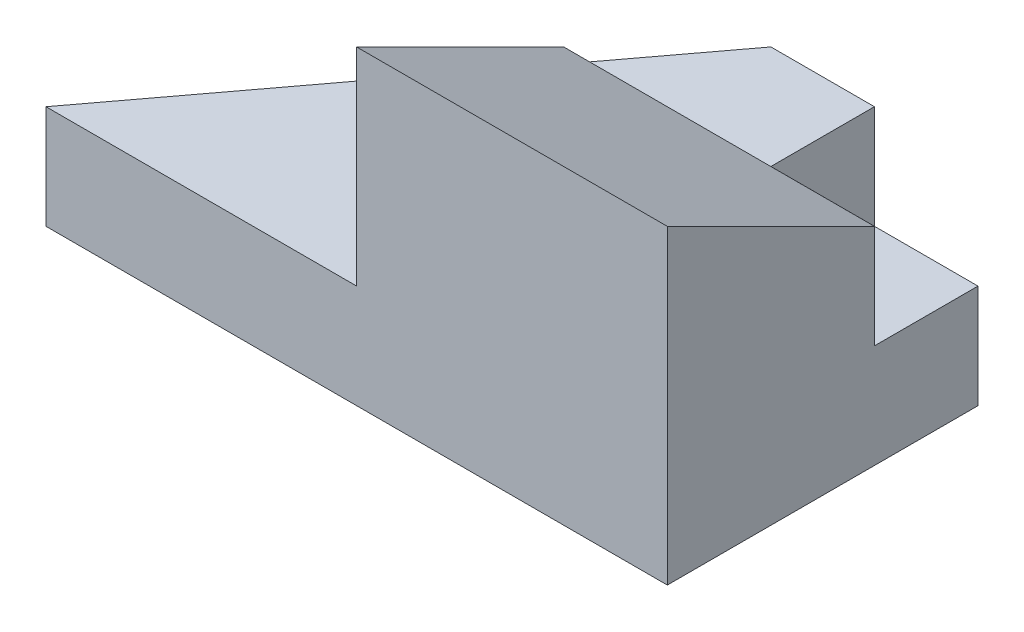
ISO-10303-21;
HEADER;
FILE_DESCRIPTION(('STEP AP214'),'2;1');
FILE_NAME('part.step','',(''),(''),'','','');
FILE_SCHEMA(('AUTOMOTIVE_DESIGN { 1 0 10303 214 1 1 1 1 }'));
ENDSEC;
DATA;
#1=APPLICATION_CONTEXT('core data for automotive mechanical design processes');
#2=APPLICATION_PROTOCOL_DEFINITION('international standard','automotive_design',2000,#1);
#3=PRODUCT_CONTEXT('',#1,'mechanical');
#4=PRODUCT('Part','Part','',(#3));
#5=PRODUCT_RELATED_PRODUCT_CATEGORY('part','',(#4));
#6=PRODUCT_DEFINITION_FORMATION('','',#4);
#7=PRODUCT_DEFINITION_CONTEXT('part definition',#1,'design');
#8=PRODUCT_DEFINITION('design','',#6,#7);
#9=PRODUCT_DEFINITION_SHAPE('','',#8);
#10=(LENGTH_UNIT() NAMED_UNIT(*) SI_UNIT(.MILLI.,.METRE.));
#11=(NAMED_UNIT(*) PLANE_ANGLE_UNIT() SI_UNIT($,.RADIAN.));
#12=(NAMED_UNIT(*) SI_UNIT($,.STERADIAN.) SOLID_ANGLE_UNIT());
#13=UNCERTAINTY_MEASURE_WITH_UNIT(LENGTH_MEASURE(1.E-05),#10,'distance_accuracy_value','');
#14=(GEOMETRIC_REPRESENTATION_CONTEXT(3) GLOBAL_UNCERTAINTY_ASSIGNED_CONTEXT((#13)) GLOBAL_UNIT_ASSIGNED_CONTEXT((#10,
#11,#12)) REPRESENTATION_CONTEXT('',''));
#15=CARTESIAN_POINT('',(0.,0.,0.));
#16=DIRECTION('',(0.,0.,1.));
#17=DIRECTION('',(1.,0.,0.));
#18=AXIS2_PLACEMENT_3D('',#15,#16,#17);
#19=CARTESIAN_POINT('',(0.,0.,1016.));
#20=DIRECTION('',(-1.,0.,0.));
#21=DIRECTION('',(0.,0.,1.));
#22=AXIS2_PLACEMENT_3D('',#19,#20,#21);
#23=PLANE('',#22);
#24=DIRECTION('',(0.,1.,0.));
#25=VECTOR('',#24,1.);
#26=CARTESIAN_POINT('',(0.,0.,508.));
#27=LINE('',#26,#25);
#28=CARTESIAN_POINT('',(0.,254.121643215491,508.));
#29=VERTEX_POINT('',#28);
#30=CARTESIAN_POINT('',(0.,508.060821607745,508.));
#31=VERTEX_POINT('',#30);
#32=EDGE_CURVE('E179',#29,#31,#27,.T.);
#33=ORIENTED_EDGE('',*,*,#32,.T.);
#34=DIRECTION('',(0.,0.447127919267341,0.894470023987198));
#35=VECTOR('',#34,1.);
#36=CARTESIAN_POINT('',(0.,609.658387344484,711.243799247628));
#37=LINE('',#36,#35);
#38=CARTESIAN_POINT('',(0.,762.,1016.));
#39=VERTEX_POINT('',#38);
#40=EDGE_CURVE('E54',#31,#39,#37,.T.);
#41=ORIENTED_EDGE('',*,*,#40,.T.);
#42=DIRECTION('',(0.,1.,0.));
#43=VECTOR('',#42,1.);
#44=CARTESIAN_POINT('',(0.,0.,1016.));
#45=LINE('',#44,#43);
#46=CARTESIAN_POINT('',(0.,0.,1016.));
#47=VERTEX_POINT('',#46);
#48=EDGE_CURVE('E134',#47,#39,#45,.T.);
#49=ORIENTED_EDGE('',*,*,#48,.F.);
#50=DIRECTION('',(0.,0.,-1.));
#51=VECTOR('',#50,1.);
#52=CARTESIAN_POINT('',(0.,0.,1016.));
#53=LINE('',#52,#51);
#54=CARTESIAN_POINT('',(0.,0.,254.));
#55=VERTEX_POINT('',#54);
#56=EDGE_CURVE('E47',#47,#55,#53,.T.);
#57=ORIENTED_EDGE('',*,*,#56,.T.);
#58=DIRECTION('',(0.,1.,0.));
#59=VECTOR('',#58,1.);
#60=CARTESIAN_POINT('',(0.,-827.156356784508,254.));
#61=LINE('',#60,#59);
#62=CARTESIAN_POINT('',(0.,254.121643215491,254.));
#63=VERTEX_POINT('',#62);
#64=EDGE_CURVE('E155',#55,#63,#61,.T.);
#65=ORIENTED_EDGE('',*,*,#64,.T.);
#66=DIRECTION('',(0.,0.,1.));
#67=VECTOR('',#66,1.);
#68=CARTESIAN_POINT('',(0.,254.121643215491,1016.));
#69=LINE('',#68,#67);
#70=EDGE_CURVE('E185',#63,#29,#69,.T.);
#71=ORIENTED_EDGE('',*,*,#70,.T.);
#72=EDGE_LOOP('',(#33,#41,#49,#57,#65,#71));
#73=FACE_BOUND('',#72,.T.);
#74=ADVANCED_FACE('F39',(#73),#23,.F.);
#75=CARTESIAN_POINT('',(0.,0.,1016.));
#76=DIRECTION('',(0.,-1.,0.));
#77=DIRECTION('',(1.,0.,0.));
#78=AXIS2_PLACEMENT_3D('',#75,#76,#77);
#79=PLANE('',#78);
#80=DIRECTION('',(-1.,0.,0.));
#81=VECTOR('',#80,1.);
#82=CARTESIAN_POINT('',(0.,0.,254.));
#83=LINE('',#82,#81);
#84=CARTESIAN_POINT('',(-508.045957887422,-1.11022302462516E-13,254.));
#85=VERTEX_POINT('',#84);
#86=EDGE_CURVE('E162',#55,#85,#83,.T.);
#87=ORIENTED_EDGE('',*,*,#86,.F.);
#88=ORIENTED_EDGE('',*,*,#56,.F.);
#89=DIRECTION('',(-1.,0.,0.));
#90=VECTOR('',#89,1.);
#91=CARTESIAN_POINT('',(0.,0.,1016.));
#92=LINE('',#91,#90);
#93=CARTESIAN_POINT('',(-1524.,-1.86482773667507E-13,1016.));
#94=VERTEX_POINT('',#93);
#95=EDGE_CURVE('E140',#47,#94,#92,.T.);
#96=ORIENTED_EDGE('',*,*,#95,.T.);
#97=DIRECTION('',(-0.6,0.,0.8));
#98=VECTOR('',#97,1.);
#99=CARTESIAN_POINT('',(-975.36,-1.19447150201636E-13,284.48));
#100=LINE('',#99,#98);
#101=CARTESIAN_POINT('',(-762.,-1.86482773667507E-13,0.));
#102=VERTEX_POINT('',#101);
#103=EDGE_CURVE('E128',#102,#94,#100,.T.);
#104=ORIENTED_EDGE('',*,*,#103,.F.);
#105=DIRECTION('',(-1.,0.,0.));
#106=VECTOR('',#105,1.);
#107=CARTESIAN_POINT('',(0.,0.,0.));
#108=LINE('',#107,#106);
#109=CARTESIAN_POINT('',(-508.045957887422,-1.11022302462516E-13,0.));
#110=VERTEX_POINT('',#109);
#111=EDGE_CURVE('E142',#110,#102,#108,.T.);
#112=ORIENTED_EDGE('',*,*,#111,.F.);
#113=DIRECTION('',(0.,0.,-1.));
#114=VECTOR('',#113,1.);
#115=CARTESIAN_POINT('',(-508.045957887422,0.,1016.));
#116=LINE('',#115,#114);
#117=EDGE_CURVE('E164',#85,#110,#116,.T.);
#118=ORIENTED_EDGE('',*,*,#117,.F.);
#119=EDGE_LOOP('',(#87,#88,#96,#104,#112,#118));
#120=FACE_BOUND('',#119,.T.);
#121=ADVANCED_FACE('F159',(#120),#79,.T.);
#122=CARTESIAN_POINT('',(0.,0.,1016.));
#123=DIRECTION('',(0.,0.,1.));
#124=DIRECTION('',(1.,0.,0.));
#125=AXIS2_PLACEMENT_3D('',#122,#123,#124);
#126=PLANE('',#125);
#127=DIRECTION('',(-1.,0.,0.));
#128=VECTOR('',#127,1.);
#129=CARTESIAN_POINT('',(-1524.,254.121643215491,1016.));
#130=LINE('',#129,#128);
#131=CARTESIAN_POINT('',(-762.,254.121643215491,1016.));
#132=VERTEX_POINT('',#131);
#133=CARTESIAN_POINT('',(-1524.,254.121643215491,1016.));
#134=VERTEX_POINT('',#133);
#135=EDGE_CURVE('E127',#132,#134,#130,.T.);
#136=ORIENTED_EDGE('',*,*,#135,.T.);
#137=DIRECTION('',(0.,1.,0.));
#138=VECTOR('',#137,1.);
#139=CARTESIAN_POINT('',(-1524.,-1.86636172190057E-13,1016.));
#140=LINE('',#139,#138);
#141=EDGE_CURVE('E136',#94,#134,#140,.T.);
#142=ORIENTED_EDGE('',*,*,#141,.F.);
#143=ORIENTED_EDGE('',*,*,#95,.F.);
#144=ORIENTED_EDGE('',*,*,#48,.T.);
#145=DIRECTION('',(-1.,0.,0.));
#146=VECTOR('',#145,1.);
#147=CARTESIAN_POINT('',(0.,762.,1016.));
#148=LINE('',#147,#146);
#149=CARTESIAN_POINT('',(-762.,762.,1016.));
#150=VERTEX_POINT('',#149);
#151=EDGE_CURVE('E112',#39,#150,#148,.T.);
#152=ORIENTED_EDGE('',*,*,#151,.T.);
#153=DIRECTION('',(0.,-1.,0.));
#154=VECTOR('',#153,1.);
#155=CARTESIAN_POINT('',(-762.,762.,1016.));
#156=LINE('',#155,#154);
#157=EDGE_CURVE('E119',#150,#132,#156,.T.);
#158=ORIENTED_EDGE('',*,*,#157,.T.);
#159=EDGE_LOOP('',(#136,#142,#143,#144,#152,#158));
#160=FACE_BOUND('',#159,.T.);
#161=ADVANCED_FACE('F131',(#160),#126,.T.);
#162=CARTESIAN_POINT('',(0.,0.,0.));
#163=DIRECTION('',(0.,0.,1.));
#164=DIRECTION('',(1.,0.,0.));
#165=AXIS2_PLACEMENT_3D('',#162,#163,#164);
#166=PLANE('',#165);
#167=DIRECTION('',(-1.,0.,0.));
#168=VECTOR('',#167,1.);
#169=CARTESIAN_POINT('',(319.278,254.121643215491,0.));
#170=LINE('',#169,#168);
#171=CARTESIAN_POINT('',(-508.045957887422,254.121643215491,0.));
#172=VERTEX_POINT('',#171);
#173=CARTESIAN_POINT('',(-762.,254.121643215491,0.));
#174=VERTEX_POINT('',#173);
#175=EDGE_CURVE('E182',#172,#174,#170,.T.);
#176=ORIENTED_EDGE('',*,*,#175,.F.);
#177=DIRECTION('',(0.,1.,0.));
#178=VECTOR('',#177,1.);
#179=CARTESIAN_POINT('',(-508.045957887422,-827.156356784508,0.));
#180=LINE('',#179,#178);
#181=EDGE_CURVE('E61',#110,#172,#180,.T.);
#182=ORIENTED_EDGE('',*,*,#181,.F.);
#183=ORIENTED_EDGE('',*,*,#111,.T.);
#184=DIRECTION('',(0.,1.,0.));
#185=VECTOR('',#184,1.);
#186=CARTESIAN_POINT('',(-762.,-6.48235678450876,0.));
#187=LINE('',#186,#185);
#188=EDGE_CURVE('E192',#102,#174,#187,.T.);
#189=ORIENTED_EDGE('',*,*,#188,.T.);
#190=EDGE_LOOP('',(#176,#182,#183,#189));
#191=FACE_BOUND('',#190,.T.);
#192=ADVANCED_FACE('F210',(#191),#166,.F.);
#193=CARTESIAN_POINT('',(-1524.,254.121643215491,1016.));
#194=DIRECTION('',(0.,-1.,0.));
#195=DIRECTION('',(0.,0.,-1.));
#196=AXIS2_PLACEMENT_3D('',#193,#194,#195);
#197=PLANE('',#196);
#198=ORIENTED_EDGE('',*,*,#70,.F.);
#199=DIRECTION('',(1.,0.,0.));
#200=VECTOR('',#199,1.);
#201=CARTESIAN_POINT('',(0.,254.121643215491,254.));
#202=LINE('',#201,#200);
#203=CARTESIAN_POINT('',(-508.045957887422,254.121643215491,254.));
#204=VERTEX_POINT('',#203);
#205=EDGE_CURVE('E213',#204,#63,#202,.T.);
#206=ORIENTED_EDGE('',*,*,#205,.F.);
#207=DIRECTION('',(0.,0.,1.));
#208=VECTOR('',#207,1.);
#209=CARTESIAN_POINT('',(-508.045957887422,254.121643215491,0.));
#210=LINE('',#209,#208);
#211=EDGE_CURVE('E217',#172,#204,#210,.T.);
#212=ORIENTED_EDGE('',*,*,#211,.F.);
#213=ORIENTED_EDGE('',*,*,#175,.T.);
#214=DIRECTION('',(0.6,0.,-0.8));
#215=VECTOR('',#214,1.);
#216=CARTESIAN_POINT('',(-1524.,254.121643215491,1016.));
#217=LINE('',#216,#215);
#218=EDGE_CURVE('E188',#134,#174,#217,.T.);
#219=ORIENTED_EDGE('',*,*,#218,.F.);
#220=ORIENTED_EDGE('',*,*,#135,.F.);
#221=DIRECTION('',(0.,0.,-1.));
#222=VECTOR('',#221,1.);
#223=CARTESIAN_POINT('',(-762.,254.121643215491,1016.));
#224=LINE('',#223,#222);
#225=CARTESIAN_POINT('',(-762.,254.121643215491,508.));
#226=VERTEX_POINT('',#225);
#227=EDGE_CURVE('E122',#132,#226,#224,.T.);
#228=ORIENTED_EDGE('',*,*,#227,.T.);
#229=DIRECTION('',(-1.,0.,0.));
#230=VECTOR('',#229,1.);
#231=CARTESIAN_POINT('',(319.278,254.121643215491,508.));
#232=LINE('',#231,#230);
#233=EDGE_CURVE('E172',#29,#226,#232,.T.);
#234=ORIENTED_EDGE('',*,*,#233,.F.);
#235=EDGE_LOOP('',(#198,#206,#212,#213,#219,#220,#228,#234));
#236=FACE_BOUND('',#235,.T.);
#237=ADVANCED_FACE('F202',(#236),#197,.F.);
#238=CARTESIAN_POINT('',(-762.,762.,1016.));
#239=DIRECTION('',(1.,0.,0.));
#240=DIRECTION('',(0.,0.,-1.));
#241=AXIS2_PLACEMENT_3D('',#238,#239,#240);
#242=PLANE('',#241);
#243=ORIENTED_EDGE('',*,*,#157,.F.);
#244=DIRECTION('',(0.,0.447127919267341,0.894470023987198));
#245=VECTOR('',#244,1.);
#246=CARTESIAN_POINT('',(-762.,508.060821607745,508.));
#247=LINE('',#246,#245);
#248=CARTESIAN_POINT('',(-762.,508.060821607745,508.));
#249=VERTEX_POINT('',#248);
#250=EDGE_CURVE('E108',#249,#150,#247,.T.);
#251=ORIENTED_EDGE('',*,*,#250,.F.);
#252=DIRECTION('',(0.,1.,0.));
#253=VECTOR('',#252,1.);
#254=CARTESIAN_POINT('',(-762.,254.121643215491,508.));
#255=LINE('',#254,#253);
#256=EDGE_CURVE('E168',#226,#249,#255,.T.);
#257=ORIENTED_EDGE('',*,*,#256,.F.);
#258=ORIENTED_EDGE('',*,*,#227,.F.);
#259=EDGE_LOOP('',(#243,#251,#257,#258));
#260=FACE_BOUND('',#259,.T.);
#261=ADVANCED_FACE('F120',(#260),#242,.F.);
#262=CARTESIAN_POINT('',(-1524.,-6.48235678450876,1016.));
#263=DIRECTION('',(0.8,0.,0.6));
#264=DIRECTION('',(0.6,0.,-0.8));
#265=AXIS2_PLACEMENT_3D('',#262,#263,#264);
#266=PLANE('',#265);
#267=ORIENTED_EDGE('',*,*,#103,.T.);
#268=ORIENTED_EDGE('',*,*,#141,.T.);
#269=ORIENTED_EDGE('',*,*,#218,.T.);
#270=ORIENTED_EDGE('',*,*,#188,.F.);
#271=EDGE_LOOP('',(#267,#268,#269,#270));
#272=FACE_BOUND('',#271,.T.);
#273=ADVANCED_FACE('F206',(#272),#266,.F.);
#274=CARTESIAN_POINT('',(319.278,254.121643215491,508.));
#275=DIRECTION('',(0.,0.,1.));
#276=DIRECTION('',(1.,0.,0.));
#277=AXIS2_PLACEMENT_3D('',#274,#275,#276);
#278=PLANE('',#277);
#279=ORIENTED_EDGE('',*,*,#256,.T.);
#280=DIRECTION('',(1.,0.,0.));
#281=VECTOR('',#280,1.);
#282=CARTESIAN_POINT('',(319.278,508.060821607745,508.));
#283=LINE('',#282,#281);
#284=EDGE_CURVE('E11',#249,#31,#283,.T.);
#285=ORIENTED_EDGE('',*,*,#284,.T.);
#286=ORIENTED_EDGE('',*,*,#32,.F.);
#287=ORIENTED_EDGE('',*,*,#233,.T.);
#288=EDGE_LOOP('',(#279,#285,#286,#287));
#289=FACE_BOUND('',#288,.T.);
#290=ADVANCED_FACE('F227',(#289),#278,.F.);
#291=CARTESIAN_POINT('',(0.,-827.156356784508,254.));
#292=DIRECTION('',(0.,0.,1.));
#293=DIRECTION('',(1.,0.,0.));
#294=AXIS2_PLACEMENT_3D('',#291,#292,#293);
#295=PLANE('',#294);
#296=ORIENTED_EDGE('',*,*,#86,.T.);
#297=DIRECTION('',(0.,1.,0.));
#298=VECTOR('',#297,1.);
#299=CARTESIAN_POINT('',(-508.045957887422,-827.156356784508,254.));
#300=LINE('',#299,#298);
#301=EDGE_CURVE('E212',#85,#204,#300,.T.);
#302=ORIENTED_EDGE('',*,*,#301,.T.);
#303=ORIENTED_EDGE('',*,*,#205,.T.);
#304=ORIENTED_EDGE('',*,*,#64,.F.);
#305=EDGE_LOOP('',(#296,#302,#303,#304));
#306=FACE_BOUND('',#305,.T.);
#307=ADVANCED_FACE('F229',(#306),#295,.F.);
#308=CARTESIAN_POINT('',(-508.045957887422,-827.156356784508,0.));
#309=DIRECTION('',(-1.,0.,0.));
#310=DIRECTION('',(0.,0.,1.));
#311=AXIS2_PLACEMENT_3D('',#308,#309,#310);
#312=PLANE('',#311);
#313=ORIENTED_EDGE('',*,*,#117,.T.);
#314=ORIENTED_EDGE('',*,*,#181,.T.);
#315=ORIENTED_EDGE('',*,*,#211,.T.);
#316=ORIENTED_EDGE('',*,*,#301,.F.);
#317=EDGE_LOOP('',(#313,#314,#315,#316));
#318=FACE_BOUND('',#317,.T.);
#319=ADVANCED_FACE('F235',(#318),#312,.F.);
#320=CARTESIAN_POINT('',(73.4060000000001,508.060821607745,508.));
#321=DIRECTION('',(0.,-0.894470023987198,0.447127919267341));
#322=DIRECTION('',(0.,-0.447127919267341,-0.894470023987198));
#323=AXIS2_PLACEMENT_3D('',#320,#321,#322);
#324=PLANE('',#323);
#325=ORIENTED_EDGE('',*,*,#284,.F.);
#326=ORIENTED_EDGE('',*,*,#250,.T.);
#327=ORIENTED_EDGE('',*,*,#151,.F.);
#328=ORIENTED_EDGE('',*,*,#40,.F.);
#329=EDGE_LOOP('',(#325,#326,#327,#328));
#330=FACE_BOUND('',#329,.T.);
#331=ADVANCED_FACE('F110',(#330),#324,.F.);
#332=CLOSED_SHELL('',(#74,#121,#161,#192,#237,#261,#273,#290,#307,#319,#331));
#333=MANIFOLD_SOLID_BREP('B2',#332);
#334=ADVANCED_BREP_SHAPE_REPRESENTATION('',(#18,#333),#14);
#335=SHAPE_DEFINITION_REPRESENTATION(#9,#334);
ENDSEC;
END-ISO-10303-21;
